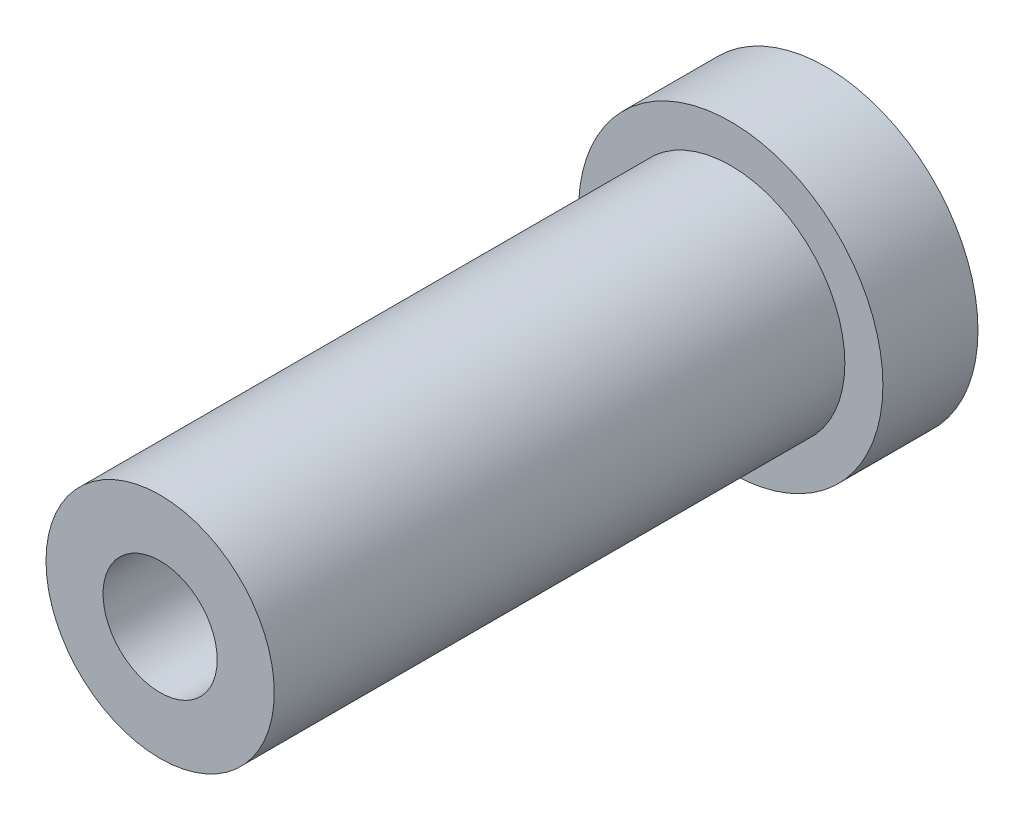
ISO-10303-21;
HEADER;
FILE_DESCRIPTION(('STEP AP214'),'2;1');
FILE_NAME('part.step','',(''),(''),'','','');
FILE_SCHEMA(('AUTOMOTIVE_DESIGN { 1 0 10303 214 1 1 1 1 }'));
ENDSEC;
DATA;
#1=APPLICATION_CONTEXT('core data for automotive mechanical design processes');
#2=APPLICATION_PROTOCOL_DEFINITION('international standard','automotive_design',2000,#1);
#3=PRODUCT_CONTEXT('',#1,'mechanical');
#4=PRODUCT('Part','Part','',(#3));
#5=PRODUCT_RELATED_PRODUCT_CATEGORY('part','',(#4));
#6=PRODUCT_DEFINITION_FORMATION('','',#4);
#7=PRODUCT_DEFINITION_CONTEXT('part definition',#1,'design');
#8=PRODUCT_DEFINITION('design','',#6,#7);
#9=PRODUCT_DEFINITION_SHAPE('','',#8);
#10=(LENGTH_UNIT() NAMED_UNIT(*) SI_UNIT(.MILLI.,.METRE.));
#11=(NAMED_UNIT(*) PLANE_ANGLE_UNIT() SI_UNIT($,.RADIAN.));
#12=(NAMED_UNIT(*) SI_UNIT($,.STERADIAN.) SOLID_ANGLE_UNIT());
#13=UNCERTAINTY_MEASURE_WITH_UNIT(LENGTH_MEASURE(1.E-05),#10,'distance_accuracy_value','');
#14=(GEOMETRIC_REPRESENTATION_CONTEXT(3) GLOBAL_UNCERTAINTY_ASSIGNED_CONTEXT((#13)) GLOBAL_UNIT_ASSIGNED_CONTEXT((#10,
#11,#12)) REPRESENTATION_CONTEXT('',''));
#15=CARTESIAN_POINT('',(0.,0.,0.));
#16=DIRECTION('',(0.,0.,1.));
#17=DIRECTION('',(1.,0.,0.));
#18=AXIS2_PLACEMENT_3D('',#15,#16,#17);
#19=CARTESIAN_POINT('',(0.,0.,2.5));
#20=DIRECTION('',(0.,0.,-1.));
#21=DIRECTION('',(-1.,0.,0.));
#22=AXIS2_PLACEMENT_3D('',#19,#20,#21);
#23=CYLINDRICAL_SURFACE('',#22,4.);
#24=CARTESIAN_POINT('',(0.,0.,2.5));
#25=DIRECTION('',(0.,0.,1.));
#26=DIRECTION('',(1.,0.,0.));
#27=AXIS2_PLACEMENT_3D('',#24,#25,#26);
#28=CIRCLE('',#27,4.);
#29=CARTESIAN_POINT('',(4.,0.,2.5));
#30=VERTEX_POINT('',#29);
#31=EDGE_CURVE('E41',#30,#30,#28,.T.);
#32=ORIENTED_EDGE('',*,*,#31,.F.);
#33=EDGE_LOOP('',(#32));
#34=FACE_BOUND('',#33,.T.);
#35=CARTESIAN_POINT('',(0.,0.,0.));
#36=DIRECTION('',(0.,0.,1.));
#37=DIRECTION('',(1.,0.,0.));
#38=AXIS2_PLACEMENT_3D('',#35,#36,#37);
#39=CIRCLE('',#38,4.);
#40=CARTESIAN_POINT('',(4.,0.,0.));
#41=VERTEX_POINT('',#40);
#42=EDGE_CURVE('E37',#41,#41,#39,.T.);
#43=ORIENTED_EDGE('',*,*,#42,.T.);
#44=EDGE_LOOP('',(#43));
#45=FACE_BOUND('',#44,.T.);
#46=ADVANCED_FACE('F34',(#34,#45),#23,.T.);
#47=CARTESIAN_POINT('',(0.,0.,2.5));
#48=DIRECTION('',(0.,0.,1.));
#49=DIRECTION('',(1.,0.,0.));
#50=AXIS2_PLACEMENT_3D('',#47,#48,#49);
#51=PLANE('',#50);
#52=CARTESIAN_POINT('',(0.,0.,2.5));
#53=DIRECTION('',(0.,0.,1.));
#54=DIRECTION('',(1.,0.,0.));
#55=AXIS2_PLACEMENT_3D('',#52,#53,#54);
#56=CIRCLE('',#55,3.);
#57=CARTESIAN_POINT('',(3.,0.,2.5));
#58=VERTEX_POINT('',#57);
#59=EDGE_CURVE('E10',#58,#58,#56,.T.);
#60=ORIENTED_EDGE('',*,*,#59,.F.);
#61=EDGE_LOOP('',(#60));
#62=FACE_BOUND('',#61,.T.);
#63=ORIENTED_EDGE('',*,*,#31,.T.);
#64=EDGE_LOOP('',(#63));
#65=FACE_BOUND('',#64,.T.);
#66=ADVANCED_FACE('F78',(#62,#65),#51,.T.);
#67=CARTESIAN_POINT('',(0.,0.,0.));
#68=DIRECTION('',(0.,0.,1.));
#69=DIRECTION('',(1.,0.,0.));
#70=AXIS2_PLACEMENT_3D('',#67,#68,#69);
#71=PLANE('',#70);
#72=ORIENTED_EDGE('',*,*,#42,.F.);
#73=EDGE_LOOP('',(#72));
#74=FACE_BOUND('',#73,.T.);
#75=ADVANCED_FACE('F73',(#74),#71,.F.);
#76=CARTESIAN_POINT('',(0.,0.,17.5));
#77=DIRECTION('',(0.,0.,-1.));
#78=DIRECTION('',(-1.,0.,0.));
#79=AXIS2_PLACEMENT_3D('',#76,#77,#78);
#80=CYLINDRICAL_SURFACE('',#79,3.);
#81=CARTESIAN_POINT('',(0.,0.,17.5));
#82=DIRECTION('',(0.,0.,1.));
#83=DIRECTION('',(1.,0.,0.));
#84=AXIS2_PLACEMENT_3D('',#81,#82,#83);
#85=CIRCLE('',#84,3.);
#86=CARTESIAN_POINT('',(3.,0.,17.5));
#87=VERTEX_POINT('',#86);
#88=EDGE_CURVE('E47',#87,#87,#85,.T.);
#89=ORIENTED_EDGE('',*,*,#88,.F.);
#90=EDGE_LOOP('',(#89));
#91=FACE_BOUND('',#90,.T.);
#92=ORIENTED_EDGE('',*,*,#59,.T.);
#93=EDGE_LOOP('',(#92));
#94=FACE_BOUND('',#93,.T.);
#95=ADVANCED_FACE('F68',(#91,#94),#80,.T.);
#96=CARTESIAN_POINT('',(0.,0.,17.5));
#97=DIRECTION('',(0.,0.,1.));
#98=DIRECTION('',(1.,0.,0.));
#99=AXIS2_PLACEMENT_3D('',#96,#97,#98);
#100=PLANE('',#99);
#101=CARTESIAN_POINT('',(0.,0.,17.5));
#102=DIRECTION('',(0.,0.,1.));
#103=DIRECTION('',(1.,0.,0.));
#104=AXIS2_PLACEMENT_3D('',#101,#102,#103);
#105=CIRCLE('',#104,1.5);
#106=CARTESIAN_POINT('',(1.5,0.,17.5));
#107=VERTEX_POINT('',#106);
#108=EDGE_CURVE('E51',#107,#107,#105,.T.);
#109=ORIENTED_EDGE('',*,*,#108,.F.);
#110=EDGE_LOOP('',(#109));
#111=FACE_BOUND('',#110,.T.);
#112=ORIENTED_EDGE('',*,*,#88,.T.);
#113=EDGE_LOOP('',(#112));
#114=FACE_BOUND('',#113,.T.);
#115=ADVANCED_FACE('F62',(#111,#114),#100,.T.);
#116=CARTESIAN_POINT('',(0.,0.,2.5));
#117=DIRECTION('',(0.,0.,1.));
#118=DIRECTION('',(1.,0.,0.));
#119=AXIS2_PLACEMENT_3D('',#116,#117,#118);
#120=CYLINDRICAL_SURFACE('',#119,1.5);
#121=CARTESIAN_POINT('',(0.,0.,2.5));
#122=DIRECTION('',(0.,0.,1.));
#123=DIRECTION('',(1.,0.,0.));
#124=AXIS2_PLACEMENT_3D('',#121,#122,#123);
#125=CIRCLE('',#124,1.5);
#126=CARTESIAN_POINT('',(1.5,0.,2.5));
#127=VERTEX_POINT('',#126);
#128=EDGE_CURVE('E50',#127,#127,#125,.T.);
#129=ORIENTED_EDGE('',*,*,#128,.F.);
#130=EDGE_LOOP('',(#129));
#131=FACE_BOUND('',#130,.T.);
#132=ORIENTED_EDGE('',*,*,#108,.T.);
#133=EDGE_LOOP('',(#132));
#134=FACE_BOUND('',#133,.T.);
#135=ADVANCED_FACE('F59',(#131,#134),#120,.F.);
#136=CARTESIAN_POINT('',(0.,0.,2.5));
#137=DIRECTION('',(0.,0.,1.));
#138=DIRECTION('',(1.,0.,0.));
#139=AXIS2_PLACEMENT_3D('',#136,#137,#138);
#140=PLANE('',#139);
#141=ORIENTED_EDGE('',*,*,#128,.T.);
#142=EDGE_LOOP('',(#141));
#143=FACE_BOUND('',#142,.T.);
#144=ADVANCED_FACE('F57',(#143),#140,.T.);
#145=CLOSED_SHELL('',(#46,#66,#75,#95,#115,#135,#144));
#146=MANIFOLD_SOLID_BREP('B2',#145);
#147=ADVANCED_BREP_SHAPE_REPRESENTATION('',(#18,#146),#14);
#148=SHAPE_DEFINITION_REPRESENTATION(#9,#147);
ENDSEC;
END-ISO-10303-21;
